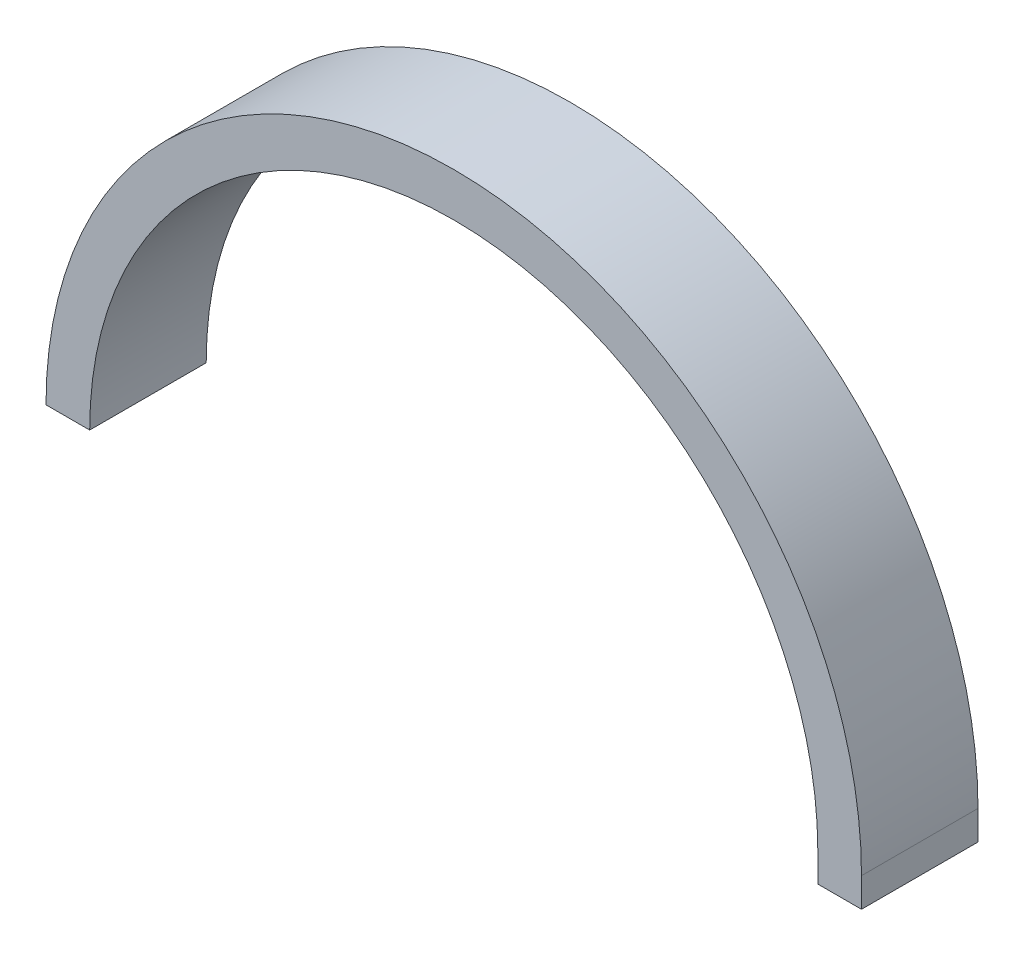
ISO-10303-21;
HEADER;
FILE_DESCRIPTION(('STEP AP214'),'2;1');
FILE_NAME('part.step','',(''),(''),'','','');
FILE_SCHEMA(('AUTOMOTIVE_DESIGN { 1 0 10303 214 1 1 1 1 }'));
ENDSEC;
DATA;
#1=APPLICATION_CONTEXT('core data for automotive mechanical design processes');
#2=APPLICATION_PROTOCOL_DEFINITION('international standard','automotive_design',2000,#1);
#3=PRODUCT_CONTEXT('',#1,'mechanical');
#4=PRODUCT('Part','Part','',(#3));
#5=PRODUCT_RELATED_PRODUCT_CATEGORY('part','',(#4));
#6=PRODUCT_DEFINITION_FORMATION('','',#4);
#7=PRODUCT_DEFINITION_CONTEXT('part definition',#1,'design');
#8=PRODUCT_DEFINITION('design','',#6,#7);
#9=PRODUCT_DEFINITION_SHAPE('','',#8);
#10=(LENGTH_UNIT() NAMED_UNIT(*) SI_UNIT(.MILLI.,.METRE.));
#11=(NAMED_UNIT(*) PLANE_ANGLE_UNIT() SI_UNIT($,.RADIAN.));
#12=(NAMED_UNIT(*) SI_UNIT($,.STERADIAN.) SOLID_ANGLE_UNIT());
#13=UNCERTAINTY_MEASURE_WITH_UNIT(LENGTH_MEASURE(1.E-05),#10,'distance_accuracy_value','');
#14=(GEOMETRIC_REPRESENTATION_CONTEXT(3) GLOBAL_UNCERTAINTY_ASSIGNED_CONTEXT((#13)) GLOBAL_UNIT_ASSIGNED_CONTEXT((#10,
#11,#12)) REPRESENTATION_CONTEXT('',''));
#15=CARTESIAN_POINT('',(0.,0.,0.));
#16=DIRECTION('',(0.,0.,1.));
#17=DIRECTION('',(1.,0.,0.));
#18=AXIS2_PLACEMENT_3D('',#15,#16,#17);
#19=CARTESIAN_POINT('',(0.,0.,40.));
#20=DIRECTION('',(0.,0.,-1.));
#21=DIRECTION('',(-1.,0.,0.));
#22=AXIS2_PLACEMENT_3D('',#19,#20,#21);
#23=CYLINDRICAL_SURFACE('',#22,125.);
#24=CARTESIAN_POINT('',(0.,0.,0.));
#25=DIRECTION('',(0.,0.,-1.));
#26=DIRECTION('',(-1.,0.,0.));
#27=AXIS2_PLACEMENT_3D('',#24,#25,#26);
#28=CIRCLE('',#27,125.);
#29=CARTESIAN_POINT('',(-125.,0.,0.));
#30=VERTEX_POINT('',#29);
#31=CARTESIAN_POINT('',(125.,0.,0.));
#32=VERTEX_POINT('',#31);
#33=EDGE_CURVE('E123',#30,#32,#28,.T.);
#34=ORIENTED_EDGE('',*,*,#33,.T.);
#35=DIRECTION('',(0.,0.,-1.));
#36=VECTOR('',#35,1.);
#37=CARTESIAN_POINT('',(125.,0.,40.));
#38=LINE('',#37,#36);
#39=CARTESIAN_POINT('',(125.,0.,40.));
#40=VERTEX_POINT('',#39);
#41=EDGE_CURVE('E11',#40,#32,#38,.T.);
#42=ORIENTED_EDGE('',*,*,#41,.F.);
#43=CARTESIAN_POINT('',(0.,0.,40.));
#44=DIRECTION('',(0.,0.,-1.));
#45=DIRECTION('',(-1.,0.,0.));
#46=AXIS2_PLACEMENT_3D('',#43,#44,#45);
#47=CIRCLE('',#46,125.);
#48=CARTESIAN_POINT('',(-125.,0.,40.));
#49=VERTEX_POINT('',#48);
#50=EDGE_CURVE('E83',#49,#40,#47,.T.);
#51=ORIENTED_EDGE('',*,*,#50,.F.);
#52=DIRECTION('',(0.,0.,-1.));
#53=VECTOR('',#52,1.);
#54=CARTESIAN_POINT('',(-125.,0.,40.));
#55=LINE('',#54,#53);
#56=EDGE_CURVE('E133',#49,#30,#55,.T.);
#57=ORIENTED_EDGE('',*,*,#56,.T.);
#58=EDGE_LOOP('',(#34,#42,#51,#57));
#59=FACE_BOUND('',#58,.T.);
#60=ADVANCED_FACE('F41',(#59),#23,.F.);
#61=CARTESIAN_POINT('',(0.,0.,40.));
#62=DIRECTION('',(0.,0.,-1.));
#63=DIRECTION('',(-1.,0.,0.));
#64=AXIS2_PLACEMENT_3D('',#61,#62,#63);
#65=CYLINDRICAL_SURFACE('',#64,140.);
#66=CARTESIAN_POINT('',(0.,0.,0.));
#67=DIRECTION('',(0.,0.,1.));
#68=DIRECTION('',(-1.,0.,0.));
#69=AXIS2_PLACEMENT_3D('',#66,#67,#68);
#70=CIRCLE('',#69,140.);
#71=CARTESIAN_POINT('',(140.,0.,0.));
#72=VERTEX_POINT('',#71);
#73=CARTESIAN_POINT('',(-140.,0.,0.));
#74=VERTEX_POINT('',#73);
#75=EDGE_CURVE('E72',#72,#74,#70,.T.);
#76=ORIENTED_EDGE('',*,*,#75,.T.);
#77=DIRECTION('',(0.,0.,-1.));
#78=VECTOR('',#77,1.);
#79=CARTESIAN_POINT('',(-140.,0.,40.));
#80=LINE('',#79,#78);
#81=CARTESIAN_POINT('',(-140.,0.,40.));
#82=VERTEX_POINT('',#81);
#83=EDGE_CURVE('E138',#82,#74,#80,.T.);
#84=ORIENTED_EDGE('',*,*,#83,.F.);
#85=CARTESIAN_POINT('',(0.,0.,40.));
#86=DIRECTION('',(0.,0.,1.));
#87=DIRECTION('',(-1.,0.,0.));
#88=AXIS2_PLACEMENT_3D('',#85,#86,#87);
#89=CIRCLE('',#88,140.);
#90=CARTESIAN_POINT('',(140.,0.,40.));
#91=VERTEX_POINT('',#90);
#92=EDGE_CURVE('E131',#91,#82,#89,.T.);
#93=ORIENTED_EDGE('',*,*,#92,.F.);
#94=DIRECTION('',(0.,0.,-1.));
#95=VECTOR('',#94,1.);
#96=CARTESIAN_POINT('',(140.,0.,40.));
#97=LINE('',#96,#95);
#98=EDGE_CURVE('E49',#91,#72,#97,.T.);
#99=ORIENTED_EDGE('',*,*,#98,.T.);
#100=EDGE_LOOP('',(#76,#84,#93,#99));
#101=FACE_BOUND('',#100,.T.);
#102=ADVANCED_FACE('F140',(#101),#65,.T.);
#103=CARTESIAN_POINT('',(-125.,0.,40.));
#104=DIRECTION('',(0.,1.,0.));
#105=DIRECTION('',(-1.,0.,0.));
#106=AXIS2_PLACEMENT_3D('',#103,#104,#105);
#107=PLANE('',#106);
#108=DIRECTION('',(1.,0.,0.));
#109=VECTOR('',#108,1.);
#110=CARTESIAN_POINT('',(-125.,0.,0.));
#111=LINE('',#110,#109);
#112=EDGE_CURVE('E78',#74,#30,#111,.T.);
#113=ORIENTED_EDGE('',*,*,#112,.T.);
#114=ORIENTED_EDGE('',*,*,#56,.F.);
#115=DIRECTION('',(1.,0.,0.));
#116=VECTOR('',#115,1.);
#117=CARTESIAN_POINT('',(-125.,0.,40.));
#118=LINE('',#117,#116);
#119=EDGE_CURVE('E57',#82,#49,#118,.T.);
#120=ORIENTED_EDGE('',*,*,#119,.F.);
#121=ORIENTED_EDGE('',*,*,#83,.T.);
#122=EDGE_LOOP('',(#113,#114,#120,#121));
#123=FACE_BOUND('',#122,.T.);
#124=ADVANCED_FACE('F150',(#123),#107,.F.);
#125=CARTESIAN_POINT('',(0.,0.,40.));
#126=DIRECTION('',(0.,0.,-1.));
#127=DIRECTION('',(-1.,0.,0.));
#128=AXIS2_PLACEMENT_3D('',#125,#126,#127);
#129=PLANE('',#128);
#130=ORIENTED_EDGE('',*,*,#50,.T.);
#131=DIRECTION('',(0.,1.,0.));
#132=VECTOR('',#131,1.);
#133=CARTESIAN_POINT('',(125.,-10.,40.));
#134=LINE('',#133,#132);
#135=CARTESIAN_POINT('',(125.,-10.,40.));
#136=VERTEX_POINT('',#135);
#137=EDGE_CURVE('E146',#136,#40,#134,.T.);
#138=ORIENTED_EDGE('',*,*,#137,.F.);
#139=DIRECTION('',(-1.,0.,0.));
#140=VECTOR('',#139,1.);
#141=CARTESIAN_POINT('',(125.,-10.,40.));
#142=LINE('',#141,#140);
#143=CARTESIAN_POINT('',(140.,-10.,40.));
#144=VERTEX_POINT('',#143);
#145=EDGE_CURVE('E118',#144,#136,#142,.T.);
#146=ORIENTED_EDGE('',*,*,#145,.F.);
#147=DIRECTION('',(0.,1.,0.));
#148=VECTOR('',#147,1.);
#149=CARTESIAN_POINT('',(140.,-10.,40.));
#150=LINE('',#149,#148);
#151=EDGE_CURVE('E126',#144,#91,#150,.T.);
#152=ORIENTED_EDGE('',*,*,#151,.T.);
#153=ORIENTED_EDGE('',*,*,#92,.T.);
#154=ORIENTED_EDGE('',*,*,#119,.T.);
#155=EDGE_LOOP('',(#130,#138,#146,#152,#153,#154));
#156=FACE_BOUND('',#155,.T.);
#157=ADVANCED_FACE('F149',(#156),#129,.F.);
#158=CARTESIAN_POINT('',(0.,0.,0.));
#159=DIRECTION('',(0.,0.,-1.));
#160=DIRECTION('',(-1.,0.,0.));
#161=AXIS2_PLACEMENT_3D('',#158,#159,#160);
#162=PLANE('',#161);
#163=ORIENTED_EDGE('',*,*,#33,.F.);
#164=ORIENTED_EDGE('',*,*,#112,.F.);
#165=ORIENTED_EDGE('',*,*,#75,.F.);
#166=DIRECTION('',(0.,1.,0.));
#167=VECTOR('',#166,1.);
#168=CARTESIAN_POINT('',(140.,-10.,0.));
#169=LINE('',#168,#167);
#170=CARTESIAN_POINT('',(140.,-10.,0.));
#171=VERTEX_POINT('',#170);
#172=EDGE_CURVE('E109',#171,#72,#169,.T.);
#173=ORIENTED_EDGE('',*,*,#172,.F.);
#174=DIRECTION('',(1.,0.,0.));
#175=VECTOR('',#174,1.);
#176=CARTESIAN_POINT('',(125.,-10.,0.));
#177=LINE('',#176,#175);
#178=CARTESIAN_POINT('',(125.,-10.,0.));
#179=VERTEX_POINT('',#178);
#180=EDGE_CURVE('E102',#179,#171,#177,.T.);
#181=ORIENTED_EDGE('',*,*,#180,.F.);
#182=DIRECTION('',(0.,1.,0.));
#183=VECTOR('',#182,1.);
#184=CARTESIAN_POINT('',(125.,-10.,0.));
#185=LINE('',#184,#183);
#186=EDGE_CURVE('E107',#179,#32,#185,.T.);
#187=ORIENTED_EDGE('',*,*,#186,.T.);
#188=EDGE_LOOP('',(#163,#164,#165,#173,#181,#187));
#189=FACE_BOUND('',#188,.T.);
#190=ADVANCED_FACE('F105',(#189),#162,.T.);
#191=CARTESIAN_POINT('',(125.,-10.,40.));
#192=DIRECTION('',(1.,0.,0.));
#193=DIRECTION('',(0.,1.,0.));
#194=AXIS2_PLACEMENT_3D('',#191,#192,#193);
#195=PLANE('',#194);
#196=ORIENTED_EDGE('',*,*,#41,.T.);
#197=ORIENTED_EDGE('',*,*,#186,.F.);
#198=DIRECTION('',(0.,0.,-1.));
#199=VECTOR('',#198,1.);
#200=CARTESIAN_POINT('',(125.,-10.,40.));
#201=LINE('',#200,#199);
#202=EDGE_CURVE('E113',#136,#179,#201,.T.);
#203=ORIENTED_EDGE('',*,*,#202,.F.);
#204=ORIENTED_EDGE('',*,*,#137,.T.);
#205=EDGE_LOOP('',(#196,#197,#203,#204));
#206=FACE_BOUND('',#205,.T.);
#207=ADVANCED_FACE('F122',(#206),#195,.F.);
#208=CARTESIAN_POINT('',(140.,-10.,40.));
#209=DIRECTION('',(-1.,0.,0.));
#210=DIRECTION('',(0.,-1.,0.));
#211=AXIS2_PLACEMENT_3D('',#208,#209,#210);
#212=PLANE('',#211);
#213=ORIENTED_EDGE('',*,*,#98,.F.);
#214=ORIENTED_EDGE('',*,*,#151,.F.);
#215=DIRECTION('',(0.,0.,1.));
#216=VECTOR('',#215,1.);
#217=CARTESIAN_POINT('',(140.,-10.,40.));
#218=LINE('',#217,#216);
#219=EDGE_CURVE('E112',#171,#144,#218,.T.);
#220=ORIENTED_EDGE('',*,*,#219,.F.);
#221=ORIENTED_EDGE('',*,*,#172,.T.);
#222=EDGE_LOOP('',(#213,#214,#220,#221));
#223=FACE_BOUND('',#222,.T.);
#224=ADVANCED_FACE('F144',(#223),#212,.F.);
#225=CARTESIAN_POINT('',(0.,-10.,0.));
#226=DIRECTION('',(0.,-1.,0.));
#227=DIRECTION('',(1.,0.,0.));
#228=AXIS2_PLACEMENT_3D('',#225,#226,#227);
#229=PLANE('',#228);
#230=ORIENTED_EDGE('',*,*,#202,.T.);
#231=ORIENTED_EDGE('',*,*,#180,.T.);
#232=ORIENTED_EDGE('',*,*,#219,.T.);
#233=ORIENTED_EDGE('',*,*,#145,.T.);
#234=EDGE_LOOP('',(#230,#231,#232,#233));
#235=FACE_BOUND('',#234,.T.);
#236=ADVANCED_FACE('F116',(#235),#229,.T.);
#237=CLOSED_SHELL('',(#60,#102,#124,#157,#190,#207,#224,#236));
#238=MANIFOLD_SOLID_BREP('B2',#237);
#239=ADVANCED_BREP_SHAPE_REPRESENTATION('',(#18,#238),#14);
#240=SHAPE_DEFINITION_REPRESENTATION(#9,#239);
ENDSEC;
END-ISO-10303-21;
